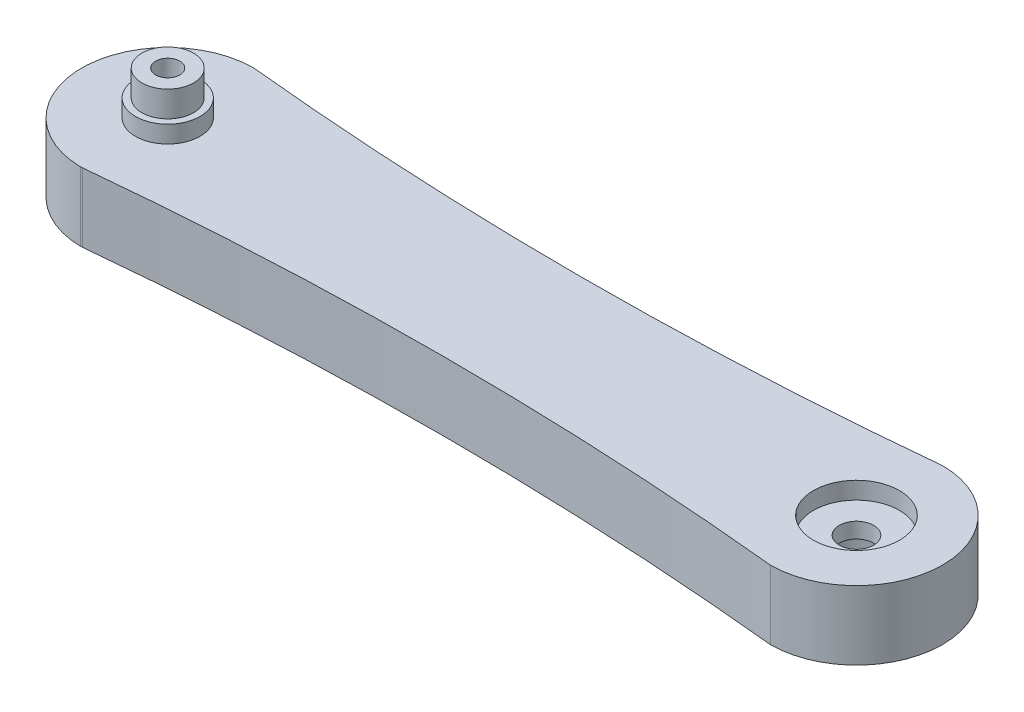
ISO-10303-21;
HEADER;
FILE_DESCRIPTION(('STEP AP214'),'2;1');
FILE_NAME('part.step','',(''),(''),'','','');
FILE_SCHEMA(('AUTOMOTIVE_DESIGN { 1 0 10303 214 1 1 1 1 }'));
ENDSEC;
DATA;
#1=APPLICATION_CONTEXT('core data for automotive mechanical design processes');
#2=APPLICATION_PROTOCOL_DEFINITION('international standard','automotive_design',2000,#1);
#3=PRODUCT_CONTEXT('',#1,'mechanical');
#4=PRODUCT('Part','Part','',(#3));
#5=PRODUCT_RELATED_PRODUCT_CATEGORY('part','',(#4));
#6=PRODUCT_DEFINITION_FORMATION('','',#4);
#7=PRODUCT_DEFINITION_CONTEXT('part definition',#1,'design');
#8=PRODUCT_DEFINITION('design','',#6,#7);
#9=PRODUCT_DEFINITION_SHAPE('','',#8);
#10=(LENGTH_UNIT() NAMED_UNIT(*) SI_UNIT(.MILLI.,.METRE.));
#11=(NAMED_UNIT(*) PLANE_ANGLE_UNIT() SI_UNIT($,.RADIAN.));
#12=(NAMED_UNIT(*) SI_UNIT($,.STERADIAN.) SOLID_ANGLE_UNIT());
#13=UNCERTAINTY_MEASURE_WITH_UNIT(LENGTH_MEASURE(1.E-05),#10,'distance_accuracy_value','');
#14=(GEOMETRIC_REPRESENTATION_CONTEXT(3) GLOBAL_UNCERTAINTY_ASSIGNED_CONTEXT((#13)) GLOBAL_UNIT_ASSIGNED_CONTEXT((#10,
#11,#12)) REPRESENTATION_CONTEXT('',''));
#15=CARTESIAN_POINT('',(0.,0.,0.));
#16=DIRECTION('',(0.,0.,1.));
#17=DIRECTION('',(1.,0.,0.));
#18=AXIS2_PLACEMENT_3D('',#15,#16,#17);
#19=CARTESIAN_POINT('',(40.,8.,0.));
#20=DIRECTION('',(0.,-1.,0.));
#21=DIRECTION('',(0.,0.,-1.));
#22=AXIS2_PLACEMENT_3D('',#19,#20,#21);
#23=PLANE('',#22);
#24=CARTESIAN_POINT('',(-40.,8.,0.));
#25=DIRECTION('',(0.,-1.,0.));
#26=DIRECTION('',(0.,0.,-1.));
#27=AXIS2_PLACEMENT_3D('',#24,#25,#26);
#28=CIRCLE('',#27,3.75000000000001);
#29=CARTESIAN_POINT('',(-40.,8.,-3.75000000000001));
#30=VERTEX_POINT('',#29);
#31=EDGE_CURVE('E138',#30,#30,#28,.F.);
#32=ORIENTED_EDGE('',*,*,#31,.F.);
#33=EDGE_LOOP('',(#32));
#34=FACE_BOUND('',#33,.T.);
#35=CARTESIAN_POINT('',(40.,8.,0.));
#36=DIRECTION('',(0.,1.,0.));
#37=DIRECTION('',(0.,0.,1.));
#38=AXIS2_PLACEMENT_3D('',#35,#36,#37);
#39=CIRCLE('',#38,5.);
#40=CARTESIAN_POINT('',(40.,8.,5.));
#41=VERTEX_POINT('',#40);
#42=EDGE_CURVE('E159',#41,#41,#39,.T.);
#43=ORIENTED_EDGE('',*,*,#42,.F.);
#44=EDGE_LOOP('',(#43));
#45=FACE_BOUND('',#44,.T.);
#46=CARTESIAN_POINT('',(-40.,8.,0.));
#47=DIRECTION('',(0.,1.,0.));
#48=DIRECTION('',(0.,0.,1.));
#49=AXIS2_PLACEMENT_3D('',#46,#47,#48);
#50=CIRCLE('',#49,10.);
#51=CARTESIAN_POINT('',(-40.1181898076533,8.,-9.99930153407561));
#52=VERTEX_POINT('',#51);
#53=CARTESIAN_POINT('',(-40.1181898076726,8.,9.99930153407538));
#54=VERTEX_POINT('',#53);
#55=EDGE_CURVE('E110',#52,#54,#50,.T.);
#56=ORIENTED_EDGE('',*,*,#55,.T.);
#57=CARTESIAN_POINT('',(-40.0945518461381,8.,7.99944122726203));
#58=DIRECTION('',(0.,-1.,0.));
#59=DIRECTION('',(0.,0.,-1.));
#60=AXIS2_PLACEMENT_3D('',#57,#58,#59);
#61=CIRCLE('',#60,2.);
#62=CARTESIAN_POINT('',(-39.895076463819,8.,9.98946875768686));
#63=VERTEX_POINT('',#62);
#64=EDGE_CURVE('E50',#54,#63,#61,.F.);
#65=ORIENTED_EDGE('',*,*,#64,.T.);
#66=CARTESIAN_POINT('',(0.,8.,407.994974842648));
#67=DIRECTION('',(0.,-1.,0.));
#68=DIRECTION('',(0.,0.,-1.));
#69=AXIS2_PLACEMENT_3D('',#66,#67,#68);
#70=CIRCLE('',#69,400.);
#71=CARTESIAN_POINT('',(40.,8.,10.));
#72=VERTEX_POINT('',#71);
#73=EDGE_CURVE('E100',#72,#63,#70,.F.);
#74=ORIENTED_EDGE('',*,*,#73,.F.);
#75=CARTESIAN_POINT('',(40.,8.,0.));
#76=DIRECTION('',(0.,1.,0.));
#77=DIRECTION('',(0.,0.,-1.));
#78=AXIS2_PLACEMENT_3D('',#75,#76,#77);
#79=CIRCLE('',#78,10.);
#80=CARTESIAN_POINT('',(40.,8.,-10.));
#81=VERTEX_POINT('',#80);
#82=EDGE_CURVE('E114',#72,#81,#79,.T.);
#83=ORIENTED_EDGE('',*,*,#82,.T.);
#84=CARTESIAN_POINT('',(0.,8.,-407.994974842648));
#85=DIRECTION('',(0.,-1.,0.));
#86=DIRECTION('',(0.,0.,-1.));
#87=AXIS2_PLACEMENT_3D('',#84,#85,#86);
#88=CIRCLE('',#87,400.);
#89=CARTESIAN_POINT('',(-39.8950764638036,8.,-9.98946875768531));
#90=VERTEX_POINT('',#89);
#91=EDGE_CURVE('E215',#81,#90,#88,.T.);
#92=ORIENTED_EDGE('',*,*,#91,.T.);
#93=CARTESIAN_POINT('',(-40.0945518461226,8.,-7.99944122726049));
#94=DIRECTION('',(0.,-1.,0.));
#95=DIRECTION('',(0.,0.,-1.));
#96=AXIS2_PLACEMENT_3D('',#93,#94,#95);
#97=CIRCLE('',#96,2.);
#98=EDGE_CURVE('E176',#90,#52,#97,.F.);
#99=ORIENTED_EDGE('',*,*,#98,.T.);
#100=EDGE_LOOP('',(#56,#65,#74,#83,#92,#99));
#101=FACE_BOUND('',#100,.T.);
#102=ADVANCED_FACE('F41',(#34,#45,#101),#23,.F.);
#103=CARTESIAN_POINT('',(40.,0.,0.));
#104=DIRECTION('',(0.,-1.,0.));
#105=DIRECTION('',(0.,0.,-1.));
#106=AXIS2_PLACEMENT_3D('',#103,#104,#105);
#107=PLANE('',#106);
#108=CARTESIAN_POINT('',(40.,0.,0.));
#109=DIRECTION('',(0.,-1.,0.));
#110=DIRECTION('',(0.,0.,-1.));
#111=AXIS2_PLACEMENT_3D('',#108,#109,#110);
#112=CIRCLE('',#111,5.25);
#113=CARTESIAN_POINT('',(40.,0.,-5.25));
#114=VERTEX_POINT('',#113);
#115=EDGE_CURVE('E153',#114,#114,#112,.T.);
#116=ORIENTED_EDGE('',*,*,#115,.F.);
#117=EDGE_LOOP('',(#116));
#118=FACE_BOUND('',#117,.T.);
#119=CARTESIAN_POINT('',(-40.,0.,0.));
#120=DIRECTION('',(0.,-1.,0.));
#121=DIRECTION('',(0.,0.,-1.));
#122=AXIS2_PLACEMENT_3D('',#119,#120,#121);
#123=CIRCLE('',#122,5.);
#124=CARTESIAN_POINT('',(-40.,0.,-5.));
#125=VERTEX_POINT('',#124);
#126=EDGE_CURVE('E194',#125,#125,#123,.T.);
#127=ORIENTED_EDGE('',*,*,#126,.F.);
#128=EDGE_LOOP('',(#127));
#129=FACE_BOUND('',#128,.T.);
#130=CARTESIAN_POINT('',(0.,0.,407.994974842648));
#131=DIRECTION('',(0.,-1.,0.));
#132=DIRECTION('',(0.,0.,1.));
#133=AXIS2_PLACEMENT_3D('',#130,#131,#132);
#134=CIRCLE('',#133,400.);
#135=CARTESIAN_POINT('',(-39.895076463819,0.,9.98946875768686));
#136=VERTEX_POINT('',#135);
#137=CARTESIAN_POINT('',(40.,0.,10.));
#138=VERTEX_POINT('',#137);
#139=EDGE_CURVE('E103',#136,#138,#134,.T.);
#140=ORIENTED_EDGE('',*,*,#139,.F.);
#141=CARTESIAN_POINT('',(-40.0945518461381,0.,7.99944122726203));
#142=DIRECTION('',(0.,-1.,0.));
#143=DIRECTION('',(0.,0.,-1.));
#144=AXIS2_PLACEMENT_3D('',#141,#142,#143);
#145=CIRCLE('',#144,2.);
#146=CARTESIAN_POINT('',(-40.1181898076726,0.,9.99930153407538));
#147=VERTEX_POINT('',#146);
#148=EDGE_CURVE('E167',#136,#147,#145,.T.);
#149=ORIENTED_EDGE('',*,*,#148,.T.);
#150=CARTESIAN_POINT('',(-40.,0.,0.));
#151=DIRECTION('',(0.,1.,0.));
#152=DIRECTION('',(0.,0.,1.));
#153=AXIS2_PLACEMENT_3D('',#150,#151,#152);
#154=CIRCLE('',#153,10.);
#155=CARTESIAN_POINT('',(-40.1181898076533,0.,-9.99930153407561));
#156=VERTEX_POINT('',#155);
#157=EDGE_CURVE('E123',#156,#147,#154,.T.);
#158=ORIENTED_EDGE('',*,*,#157,.F.);
#159=CARTESIAN_POINT('',(-40.0945518461226,0.,-7.99944122726049));
#160=DIRECTION('',(0.,-1.,0.));
#161=DIRECTION('',(0.,0.,-1.));
#162=AXIS2_PLACEMENT_3D('',#159,#160,#161);
#163=CIRCLE('',#162,2.);
#164=CARTESIAN_POINT('',(-39.8950764638036,0.,-9.98946875768531));
#165=VERTEX_POINT('',#164);
#166=EDGE_CURVE('E164',#156,#165,#163,.T.);
#167=ORIENTED_EDGE('',*,*,#166,.T.);
#168=CARTESIAN_POINT('',(0.,0.,-407.994974842648));
#169=DIRECTION('',(0.,1.,0.));
#170=DIRECTION('',(0.,0.,-1.));
#171=AXIS2_PLACEMENT_3D('',#168,#169,#170);
#172=CIRCLE('',#171,400.);
#173=CARTESIAN_POINT('',(40.,0.,-10.));
#174=VERTEX_POINT('',#173);
#175=EDGE_CURVE('E118',#165,#174,#172,.T.);
#176=ORIENTED_EDGE('',*,*,#175,.T.);
#177=CARTESIAN_POINT('',(40.,0.,0.));
#178=DIRECTION('',(0.,1.,0.));
#179=DIRECTION('',(0.,0.,-1.));
#180=AXIS2_PLACEMENT_3D('',#177,#178,#179);
#181=CIRCLE('',#180,10.);
#182=EDGE_CURVE('E128',#138,#174,#181,.T.);
#183=ORIENTED_EDGE('',*,*,#182,.F.);
#184=EDGE_LOOP('',(#140,#149,#158,#167,#176,#183));
#185=FACE_BOUND('',#184,.T.);
#186=ADVANCED_FACE('F239',(#118,#129,#185),#107,.T.);
#187=CARTESIAN_POINT('',(40.,8.,0.));
#188=DIRECTION('',(0.,-1.,0.));
#189=DIRECTION('',(0.,0.,-1.));
#190=AXIS2_PLACEMENT_3D('',#187,#188,#189);
#191=CYLINDRICAL_SURFACE('',#190,2.);
#192=CARTESIAN_POINT('',(40.,6.,0.));
#193=DIRECTION('',(0.,1.,0.));
#194=DIRECTION('',(0.,0.,1.));
#195=AXIS2_PLACEMENT_3D('',#192,#193,#194);
#196=CIRCLE('',#195,2.);
#197=CARTESIAN_POINT('',(40.,6.,2.));
#198=VERTEX_POINT('',#197);
#199=EDGE_CURVE('E149',#198,#198,#196,.T.);
#200=ORIENTED_EDGE('',*,*,#199,.T.);
#201=EDGE_LOOP('',(#200));
#202=FACE_BOUND('',#201,.T.);
#203=CARTESIAN_POINT('',(40.,4.2,0.));
#204=DIRECTION('',(0.,-1.,0.));
#205=DIRECTION('',(0.,0.,-1.));
#206=AXIS2_PLACEMENT_3D('',#203,#204,#205);
#207=CIRCLE('',#206,2.);
#208=CARTESIAN_POINT('',(40.,4.2,-2.));
#209=VERTEX_POINT('',#208);
#210=EDGE_CURVE('E155',#209,#209,#207,.T.);
#211=ORIENTED_EDGE('',*,*,#210,.T.);
#212=EDGE_LOOP('',(#211));
#213=FACE_BOUND('',#212,.T.);
#214=ADVANCED_FACE('F284',(#202,#213),#191,.F.);
#215=CARTESIAN_POINT('',(-40.,8.,0.));
#216=DIRECTION('',(0.,-1.,0.));
#217=DIRECTION('',(0.,0.,-1.));
#218=AXIS2_PLACEMENT_3D('',#215,#216,#217);
#219=CYLINDRICAL_SURFACE('',#218,1.4);
#220=CARTESIAN_POINT('',(-40.,13.,0.));
#221=DIRECTION('',(0.,-1.,0.));
#222=DIRECTION('',(0.,0.,-1.));
#223=AXIS2_PLACEMENT_3D('',#220,#221,#222);
#224=CIRCLE('',#223,1.4);
#225=CARTESIAN_POINT('',(-40.,13.,-1.4));
#226=VERTEX_POINT('',#225);
#227=EDGE_CURVE('E147',#226,#226,#224,.T.);
#228=ORIENTED_EDGE('',*,*,#227,.F.);
#229=EDGE_LOOP('',(#228));
#230=FACE_BOUND('',#229,.T.);
#231=CARTESIAN_POINT('',(-40.,6.,0.));
#232=DIRECTION('',(0.,-1.,0.));
#233=DIRECTION('',(0.,0.,-1.));
#234=AXIS2_PLACEMENT_3D('',#231,#232,#233);
#235=CIRCLE('',#234,1.4);
#236=CARTESIAN_POINT('',(-40.,6.,-1.4));
#237=VERTEX_POINT('',#236);
#238=EDGE_CURVE('E143',#237,#237,#235,.T.);
#239=ORIENTED_EDGE('',*,*,#238,.T.);
#240=EDGE_LOOP('',(#239));
#241=FACE_BOUND('',#240,.T.);
#242=ADVANCED_FACE('F287',(#230,#241),#219,.F.);
#243=CARTESIAN_POINT('',(40.,8.,0.));
#244=DIRECTION('',(0.,-1.,0.));
#245=DIRECTION('',(0.,0.,-1.));
#246=AXIS2_PLACEMENT_3D('',#243,#244,#245);
#247=CYLINDRICAL_SURFACE('',#246,10.);
#248=ORIENTED_EDGE('',*,*,#182,.T.);
#249=DIRECTION('',(0.,-1.,0.));
#250=VECTOR('',#249,1.);
#251=CARTESIAN_POINT('',(40.,8.,-10.));
#252=LINE('',#251,#250);
#253=EDGE_CURVE('E109',#81,#174,#252,.T.);
#254=ORIENTED_EDGE('',*,*,#253,.F.);
#255=ORIENTED_EDGE('',*,*,#82,.F.);
#256=DIRECTION('',(0.,-1.,0.));
#257=VECTOR('',#256,1.);
#258=CARTESIAN_POINT('',(40.,8.,10.));
#259=LINE('',#258,#257);
#260=EDGE_CURVE('E96',#72,#138,#259,.T.);
#261=ORIENTED_EDGE('',*,*,#260,.T.);
#262=EDGE_LOOP('',(#248,#254,#255,#261));
#263=FACE_BOUND('',#262,.T.);
#264=ADVANCED_FACE('F120',(#263),#247,.T.);
#265=CARTESIAN_POINT('',(-40.,8.,0.));
#266=DIRECTION('',(0.,-1.,0.));
#267=DIRECTION('',(0.,0.,-1.));
#268=AXIS2_PLACEMENT_3D('',#265,#266,#267);
#269=CYLINDRICAL_SURFACE('',#268,10.);
#270=ORIENTED_EDGE('',*,*,#157,.T.);
#271=DIRECTION('',(0.,-1.,0.));
#272=VECTOR('',#271,1.);
#273=CARTESIAN_POINT('',(-40.1181898076726,8.,9.99930153407538));
#274=LINE('',#273,#272);
#275=EDGE_CURVE('E63',#147,#54,#274,.F.);
#276=ORIENTED_EDGE('',*,*,#275,.T.);
#277=ORIENTED_EDGE('',*,*,#55,.F.);
#278=DIRECTION('',(0.,-1.,0.));
#279=VECTOR('',#278,1.);
#280=CARTESIAN_POINT('',(-40.1181898076533,8.,-9.99930153407561));
#281=LINE('',#280,#279);
#282=EDGE_CURVE('E170',#52,#156,#281,.T.);
#283=ORIENTED_EDGE('',*,*,#282,.T.);
#284=EDGE_LOOP('',(#270,#276,#277,#283));
#285=FACE_BOUND('',#284,.T.);
#286=ADVANCED_FACE('F233',(#285),#269,.T.);
#287=CARTESIAN_POINT('',(-40.,10.,0.));
#288=DIRECTION('',(0.,-1.,0.));
#289=DIRECTION('',(0.,0.,-1.));
#290=AXIS2_PLACEMENT_3D('',#287,#288,#289);
#291=CYLINDRICAL_SURFACE('',#290,3.75000000000001);
#292=CARTESIAN_POINT('',(-40.,10.,0.));
#293=DIRECTION('',(0.,1.,0.));
#294=DIRECTION('',(0.,0.,1.));
#295=AXIS2_PLACEMENT_3D('',#292,#293,#294);
#296=CIRCLE('',#295,3.75000000000001);
#297=CARTESIAN_POINT('',(-40.,10.,3.75000000000001));
#298=VERTEX_POINT('',#297);
#299=EDGE_CURVE('E131',#298,#298,#296,.T.);
#300=ORIENTED_EDGE('',*,*,#299,.F.);
#301=EDGE_LOOP('',(#300));
#302=FACE_BOUND('',#301,.T.);
#303=ORIENTED_EDGE('',*,*,#31,.T.);
#304=EDGE_LOOP('',(#303));
#305=FACE_BOUND('',#304,.T.);
#306=ADVANCED_FACE('F230',(#302,#305),#291,.T.);
#307=CARTESIAN_POINT('',(-40.,10.,0.));
#308=DIRECTION('',(0.,1.,0.));
#309=DIRECTION('',(0.,0.,1.));
#310=AXIS2_PLACEMENT_3D('',#307,#308,#309);
#311=PLANE('',#310);
#312=CARTESIAN_POINT('',(-40.,10.,0.));
#313=DIRECTION('',(0.,1.,0.));
#314=DIRECTION('',(0.,0.,1.));
#315=AXIS2_PLACEMENT_3D('',#312,#313,#314);
#316=CIRCLE('',#315,3.);
#317=CARTESIAN_POINT('',(-40.,10.,3.));
#318=VERTEX_POINT('',#317);
#319=EDGE_CURVE('E142',#318,#318,#316,.T.);
#320=ORIENTED_EDGE('',*,*,#319,.F.);
#321=EDGE_LOOP('',(#320));
#322=FACE_BOUND('',#321,.T.);
#323=ORIENTED_EDGE('',*,*,#299,.T.);
#324=EDGE_LOOP('',(#323));
#325=FACE_BOUND('',#324,.T.);
#326=ADVANCED_FACE('F228',(#322,#325),#311,.T.);
#327=CARTESIAN_POINT('',(-40.,13.,0.));
#328=DIRECTION('',(0.,-1.,0.));
#329=DIRECTION('',(0.,0.,-1.));
#330=AXIS2_PLACEMENT_3D('',#327,#328,#329);
#331=CYLINDRICAL_SURFACE('',#330,3.);
#332=CARTESIAN_POINT('',(-40.,13.,0.));
#333=DIRECTION('',(0.,1.,0.));
#334=DIRECTION('',(0.,0.,1.));
#335=AXIS2_PLACEMENT_3D('',#332,#333,#334);
#336=CIRCLE('',#335,3.);
#337=CARTESIAN_POINT('',(-40.,13.,3.));
#338=VERTEX_POINT('',#337);
#339=EDGE_CURVE('E184',#338,#338,#336,.T.);
#340=ORIENTED_EDGE('',*,*,#339,.F.);
#341=EDGE_LOOP('',(#340));
#342=FACE_BOUND('',#341,.T.);
#343=ORIENTED_EDGE('',*,*,#319,.T.);
#344=EDGE_LOOP('',(#343));
#345=FACE_BOUND('',#344,.T.);
#346=ADVANCED_FACE('F276',(#342,#345),#331,.T.);
#347=CARTESIAN_POINT('',(-40.,13.,0.));
#348=DIRECTION('',(0.,1.,0.));
#349=DIRECTION('',(0.,0.,1.));
#350=AXIS2_PLACEMENT_3D('',#347,#348,#349);
#351=PLANE('',#350);
#352=ORIENTED_EDGE('',*,*,#227,.T.);
#353=EDGE_LOOP('',(#352));
#354=FACE_BOUND('',#353,.T.);
#355=ORIENTED_EDGE('',*,*,#339,.T.);
#356=EDGE_LOOP('',(#355));
#357=FACE_BOUND('',#356,.T.);
#358=ADVANCED_FACE('F272',(#354,#357),#351,.T.);
#359=CARTESIAN_POINT('',(-40.,22.1421356237309,0.));
#360=DIRECTION('',(0.,-1.,0.));
#361=DIRECTION('',(0.,0.,-1.));
#362=AXIS2_PLACEMENT_3D('',#359,#360,#361);
#363=CYLINDRICAL_SURFACE('',#362,5.);
#364=CARTESIAN_POINT('',(-40.,6.,0.));
#365=DIRECTION('',(0.,-1.,0.));
#366=DIRECTION('',(0.,0.,-1.));
#367=AXIS2_PLACEMENT_3D('',#364,#365,#366);
#368=CIRCLE('',#367,5.);
#369=CARTESIAN_POINT('',(-40.,6.,-5.));
#370=VERTEX_POINT('',#369);
#371=EDGE_CURVE('E148',#370,#370,#368,.F.);
#372=ORIENTED_EDGE('',*,*,#371,.T.);
#373=EDGE_LOOP('',(#372));
#374=FACE_BOUND('',#373,.T.);
#375=ORIENTED_EDGE('',*,*,#126,.T.);
#376=EDGE_LOOP('',(#375));
#377=FACE_BOUND('',#376,.T.);
#378=ADVANCED_FACE('F268',(#374,#377),#363,.F.);
#379=CARTESIAN_POINT('',(40.,6.,0.));
#380=DIRECTION('',(0.,-1.,0.));
#381=DIRECTION('',(0.,0.,-1.));
#382=AXIS2_PLACEMENT_3D('',#379,#380,#381);
#383=PLANE('',#382);
#384=ORIENTED_EDGE('',*,*,#238,.F.);
#385=EDGE_LOOP('',(#384));
#386=FACE_BOUND('',#385,.T.);
#387=ORIENTED_EDGE('',*,*,#371,.F.);
#388=EDGE_LOOP('',(#387));
#389=FACE_BOUND('',#388,.T.);
#390=ADVANCED_FACE('F264',(#386,#389),#383,.T.);
#391=CARTESIAN_POINT('',(40.,3.2,0.));
#392=DIRECTION('',(0.,-1.,0.));
#393=DIRECTION('',(0.,0.,-1.));
#394=AXIS2_PLACEMENT_3D('',#391,#392,#393);
#395=CYLINDRICAL_SURFACE('',#394,5.25);
#396=CARTESIAN_POINT('',(40.,3.2,0.));
#397=DIRECTION('',(0.,-1.,0.));
#398=DIRECTION('',(0.,0.,-1.));
#399=AXIS2_PLACEMENT_3D('',#396,#397,#398);
#400=CIRCLE('',#399,5.25);
#401=CARTESIAN_POINT('',(40.,3.2,-5.25));
#402=VERTEX_POINT('',#401);
#403=EDGE_CURVE('E198',#402,#402,#400,.T.);
#404=ORIENTED_EDGE('',*,*,#403,.F.);
#405=EDGE_LOOP('',(#404));
#406=FACE_BOUND('',#405,.T.);
#407=ORIENTED_EDGE('',*,*,#115,.T.);
#408=EDGE_LOOP('',(#407));
#409=FACE_BOUND('',#408,.T.);
#410=ADVANCED_FACE('F256',(#406,#409),#395,.F.);
#411=CARTESIAN_POINT('',(40.,3.2,0.));
#412=DIRECTION('',(0.,-1.,0.));
#413=DIRECTION('',(0.,0.,-1.));
#414=AXIS2_PLACEMENT_3D('',#411,#412,#413);
#415=PLANE('',#414);
#416=CARTESIAN_POINT('',(40.,3.2,0.));
#417=DIRECTION('',(0.,-1.,0.));
#418=DIRECTION('',(0.,0.,-1.));
#419=AXIS2_PLACEMENT_3D('',#416,#417,#418);
#420=CIRCLE('',#419,4.00000000000001);
#421=CARTESIAN_POINT('',(40.,3.2,-4.00000000000001));
#422=VERTEX_POINT('',#421);
#423=EDGE_CURVE('E211',#422,#422,#420,.T.);
#424=ORIENTED_EDGE('',*,*,#423,.F.);
#425=EDGE_LOOP('',(#424));
#426=FACE_BOUND('',#425,.T.);
#427=ORIENTED_EDGE('',*,*,#403,.T.);
#428=EDGE_LOOP('',(#427));
#429=FACE_BOUND('',#428,.T.);
#430=ADVANCED_FACE('F246',(#426,#429),#415,.T.);
#431=CARTESIAN_POINT('',(40.,6.,0.));
#432=DIRECTION('',(0.,1.,0.));
#433=DIRECTION('',(0.,0.,1.));
#434=AXIS2_PLACEMENT_3D('',#431,#432,#433);
#435=CYLINDRICAL_SURFACE('',#434,5.);
#436=CARTESIAN_POINT('',(40.,6.,0.));
#437=DIRECTION('',(0.,1.,0.));
#438=DIRECTION('',(0.,0.,1.));
#439=AXIS2_PLACEMENT_3D('',#436,#437,#438);
#440=CIRCLE('',#439,5.);
#441=CARTESIAN_POINT('',(40.,6.,5.));
#442=VERTEX_POINT('',#441);
#443=EDGE_CURVE('E154',#442,#442,#440,.T.);
#444=ORIENTED_EDGE('',*,*,#443,.F.);
#445=EDGE_LOOP('',(#444));
#446=FACE_BOUND('',#445,.T.);
#447=ORIENTED_EDGE('',*,*,#42,.T.);
#448=EDGE_LOOP('',(#447));
#449=FACE_BOUND('',#448,.T.);
#450=ADVANCED_FACE('F243',(#446,#449),#435,.F.);
#451=CARTESIAN_POINT('',(40.,6.,0.));
#452=DIRECTION('',(0.,1.,0.));
#453=DIRECTION('',(0.,0.,1.));
#454=AXIS2_PLACEMENT_3D('',#451,#452,#453);
#455=PLANE('',#454);
#456=ORIENTED_EDGE('',*,*,#199,.F.);
#457=EDGE_LOOP('',(#456));
#458=FACE_BOUND('',#457,.T.);
#459=ORIENTED_EDGE('',*,*,#443,.T.);
#460=EDGE_LOOP('',(#459));
#461=FACE_BOUND('',#460,.T.);
#462=ADVANCED_FACE('F245',(#458,#461),#455,.T.);
#463=CARTESIAN_POINT('',(40.,4.2,0.));
#464=DIRECTION('',(0.,-1.,0.));
#465=DIRECTION('',(0.,0.,-1.));
#466=AXIS2_PLACEMENT_3D('',#463,#464,#465);
#467=CYLINDRICAL_SURFACE('',#466,4.00000000000001);
#468=CARTESIAN_POINT('',(40.,4.2,0.));
#469=DIRECTION('',(0.,-1.,0.));
#470=DIRECTION('',(0.,0.,-1.));
#471=AXIS2_PLACEMENT_3D('',#468,#469,#470);
#472=CIRCLE('',#471,4.00000000000001);
#473=CARTESIAN_POINT('',(40.,4.2,-4.00000000000001));
#474=VERTEX_POINT('',#473);
#475=EDGE_CURVE('E160',#474,#474,#472,.T.);
#476=ORIENTED_EDGE('',*,*,#475,.F.);
#477=EDGE_LOOP('',(#476));
#478=FACE_BOUND('',#477,.T.);
#479=ORIENTED_EDGE('',*,*,#423,.T.);
#480=EDGE_LOOP('',(#479));
#481=FACE_BOUND('',#480,.T.);
#482=ADVANCED_FACE('F253',(#478,#481),#467,.F.);
#483=CARTESIAN_POINT('',(40.,4.2,0.));
#484=DIRECTION('',(0.,-1.,0.));
#485=DIRECTION('',(0.,0.,-1.));
#486=AXIS2_PLACEMENT_3D('',#483,#484,#485);
#487=PLANE('',#486);
#488=ORIENTED_EDGE('',*,*,#210,.F.);
#489=EDGE_LOOP('',(#488));
#490=FACE_BOUND('',#489,.T.);
#491=ORIENTED_EDGE('',*,*,#475,.T.);
#492=EDGE_LOOP('',(#491));
#493=FACE_BOUND('',#492,.T.);
#494=ADVANCED_FACE('F313',(#490,#493),#487,.T.);
#495=CARTESIAN_POINT('',(0.,0.,-407.994974842648));
#496=DIRECTION('',(0.,1.,0.));
#497=DIRECTION('',(0.,0.,1.));
#498=AXIS2_PLACEMENT_3D('',#495,#496,#497);
#499=CYLINDRICAL_SURFACE('',#498,400.);
#500=ORIENTED_EDGE('',*,*,#175,.F.);
#501=DIRECTION('',(0.,1.,0.));
#502=VECTOR('',#501,1.);
#503=CARTESIAN_POINT('',(-39.8950764638036,0.,-9.98946875768531));
#504=LINE('',#503,#502);
#505=EDGE_CURVE('E12',#165,#90,#504,.T.);
#506=ORIENTED_EDGE('',*,*,#505,.T.);
#507=ORIENTED_EDGE('',*,*,#91,.F.);
#508=ORIENTED_EDGE('',*,*,#253,.T.);
#509=EDGE_LOOP('',(#500,#506,#507,#508));
#510=FACE_BOUND('',#509,.T.);
#511=ADVANCED_FACE('F306',(#510),#499,.F.);
#512=CARTESIAN_POINT('',(0.,0.,407.994974842648));
#513=DIRECTION('',(0.,1.,0.));
#514=DIRECTION('',(0.,0.,1.));
#515=AXIS2_PLACEMENT_3D('',#512,#513,#514);
#516=CYLINDRICAL_SURFACE('',#515,400.);
#517=ORIENTED_EDGE('',*,*,#73,.T.);
#518=DIRECTION('',(0.,1.,0.));
#519=VECTOR('',#518,1.);
#520=CARTESIAN_POINT('',(-39.895076463819,0.,9.9894687576868));
#521=LINE('',#520,#519);
#522=EDGE_CURVE('E161',#63,#136,#521,.F.);
#523=ORIENTED_EDGE('',*,*,#522,.T.);
#524=ORIENTED_EDGE('',*,*,#139,.T.);
#525=ORIENTED_EDGE('',*,*,#260,.F.);
#526=EDGE_LOOP('',(#517,#523,#524,#525));
#527=FACE_BOUND('',#526,.T.);
#528=ADVANCED_FACE('F98',(#527),#516,.F.);
#529=CARTESIAN_POINT('',(-40.0945518461381,8.,7.99944122726203));
#530=DIRECTION('',(0.,1.,0.));
#531=DIRECTION('',(0.,0.,1.));
#532=AXIS2_PLACEMENT_3D('',#529,#530,#531);
#533=CYLINDRICAL_SURFACE('',#532,2.);
#534=ORIENTED_EDGE('',*,*,#64,.F.);
#535=ORIENTED_EDGE('',*,*,#275,.F.);
#536=ORIENTED_EDGE('',*,*,#148,.F.);
#537=ORIENTED_EDGE('',*,*,#522,.F.);
#538=EDGE_LOOP('',(#534,#535,#536,#537));
#539=FACE_BOUND('',#538,.T.);
#540=ADVANCED_FACE('F298',(#539),#533,.T.);
#541=CARTESIAN_POINT('',(-40.0945518461226,0.,-7.99944122726049));
#542=DIRECTION('',(0.,1.,0.));
#543=DIRECTION('',(0.,0.,1.));
#544=AXIS2_PLACEMENT_3D('',#541,#542,#543);
#545=CYLINDRICAL_SURFACE('',#544,2.);
#546=ORIENTED_EDGE('',*,*,#98,.F.);
#547=ORIENTED_EDGE('',*,*,#505,.F.);
#548=ORIENTED_EDGE('',*,*,#166,.F.);
#549=ORIENTED_EDGE('',*,*,#282,.F.);
#550=EDGE_LOOP('',(#546,#547,#548,#549));
#551=FACE_BOUND('',#550,.T.);
#552=ADVANCED_FACE('F43',(#551),#545,.T.);
#553=CLOSED_SHELL('',(#102,#186,#214,#242,#264,#286,#306,#326,#346,#358,#378,#390,#410,#430,
#450,#462,#482,#494,#511,#528,#540,#552));
#554=MANIFOLD_SOLID_BREP('B2',#553);
#555=ADVANCED_BREP_SHAPE_REPRESENTATION('',(#18,#554),#14);
#556=SHAPE_DEFINITION_REPRESENTATION(#9,#555);
ENDSEC;
END-ISO-10303-21;
